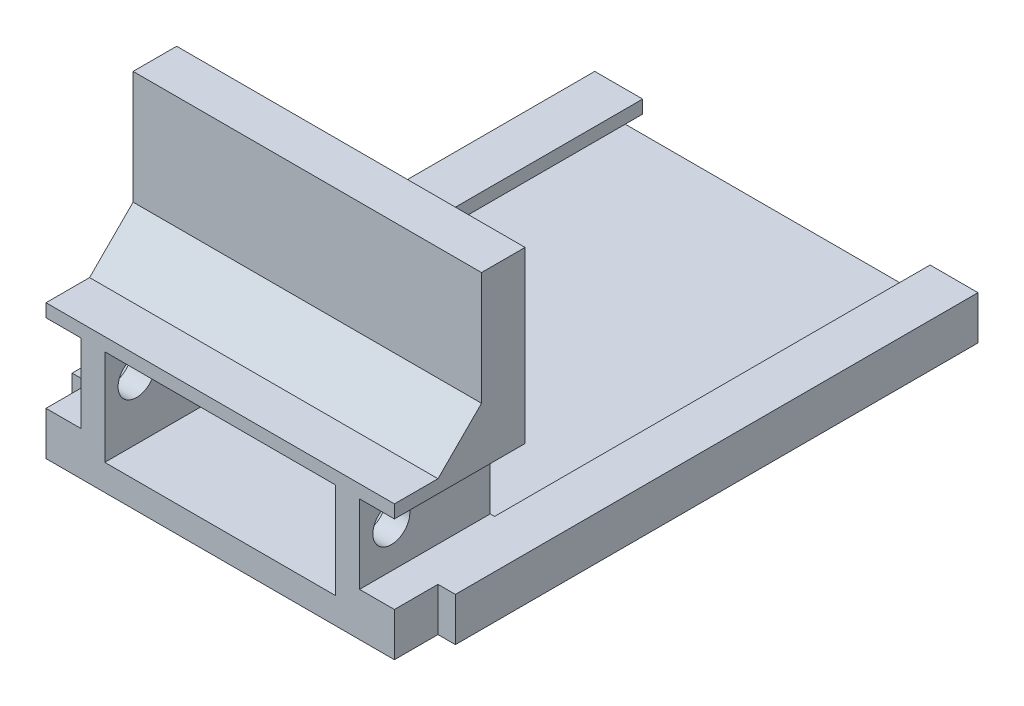
ISO-10303-21;
HEADER;
FILE_DESCRIPTION(('STEP AP214'),'2;1');
FILE_NAME('part.step','',(''),(''),'','','');
FILE_SCHEMA(('AUTOMOTIVE_DESIGN { 1 0 10303 214 1 1 1 1 }'));
ENDSEC;
DATA;
#1=APPLICATION_CONTEXT('core data for automotive mechanical design processes');
#2=APPLICATION_PROTOCOL_DEFINITION('international standard','automotive_design',2000,#1);
#3=PRODUCT_CONTEXT('',#1,'mechanical');
#4=PRODUCT('Part','Part','',(#3));
#5=PRODUCT_RELATED_PRODUCT_CATEGORY('part','',(#4));
#6=PRODUCT_DEFINITION_FORMATION('','',#4);
#7=PRODUCT_DEFINITION_CONTEXT('part definition',#1,'design');
#8=PRODUCT_DEFINITION('design','',#6,#7);
#9=PRODUCT_DEFINITION_SHAPE('','',#8);
#10=(LENGTH_UNIT() NAMED_UNIT(*) SI_UNIT(.MILLI.,.METRE.));
#11=(NAMED_UNIT(*) PLANE_ANGLE_UNIT() SI_UNIT($,.RADIAN.));
#12=(NAMED_UNIT(*) SI_UNIT($,.STERADIAN.) SOLID_ANGLE_UNIT());
#13=UNCERTAINTY_MEASURE_WITH_UNIT(LENGTH_MEASURE(1.E-05),#10,'distance_accuracy_value','');
#14=(GEOMETRIC_REPRESENTATION_CONTEXT(3) GLOBAL_UNCERTAINTY_ASSIGNED_CONTEXT((#13)) GLOBAL_UNIT_ASSIGNED_CONTEXT((#10,
#11,#12)) REPRESENTATION_CONTEXT('',''));
#15=CARTESIAN_POINT('',(0.,0.,0.));
#16=DIRECTION('',(0.,0.,1.));
#17=DIRECTION('',(1.,0.,0.));
#18=AXIS2_PLACEMENT_3D('',#15,#16,#17);
#19=CARTESIAN_POINT('',(3.99999999999999,0.,120.));
#20=DIRECTION('',(-1.,0.,0.));
#21=DIRECTION('',(0.,-1.,0.));
#22=AXIS2_PLACEMENT_3D('',#19,#20,#21);
#23=PLANE('',#22);
#24=DIRECTION('',(0.,-1.,0.));
#25=VECTOR('',#24,1.);
#26=CARTESIAN_POINT('',(3.99999999999999,57.,110.));
#27=LINE('',#26,#25);
#28=CARTESIAN_POINT('',(3.99999999999999,57.,110.));
#29=VERTEX_POINT('',#28);
#30=CARTESIAN_POINT('',(3.99999999999999,31.,110.));
#31=VERTEX_POINT('',#30);
#32=EDGE_CURVE('E246',#29,#31,#27,.T.);
#33=ORIENTED_EDGE('',*,*,#32,.F.);
#34=DIRECTION('',(0.,0.,-1.));
#35=VECTOR('',#34,1.);
#36=CARTESIAN_POINT('',(3.99999999999999,57.,120.));
#37=LINE('',#36,#35);
#38=CARTESIAN_POINT('',(3.99999999999999,57.,100.));
#39=VERTEX_POINT('',#38);
#40=EDGE_CURVE('E254',#29,#39,#37,.T.);
#41=ORIENTED_EDGE('',*,*,#40,.T.);
#42=DIRECTION('',(0.,1.,0.));
#43=VECTOR('',#42,1.);
#44=CARTESIAN_POINT('',(3.99999999999999,0.,100.));
#45=LINE('',#44,#43);
#46=CARTESIAN_POINT('',(3.99999999999999,18.,100.));
#47=VERTEX_POINT('',#46);
#48=EDGE_CURVE('E474',#47,#39,#45,.T.);
#49=ORIENTED_EDGE('',*,*,#48,.F.);
#50=DIRECTION('',(0.,0.,1.));
#51=VECTOR('',#50,1.);
#52=CARTESIAN_POINT('',(3.99999999999999,18.,42.6153330583857));
#53=LINE('',#52,#51);
#54=CARTESIAN_POINT('',(3.99999999999999,18.,130.));
#55=VERTEX_POINT('',#54);
#56=EDGE_CURVE('E489',#47,#55,#53,.T.);
#57=ORIENTED_EDGE('',*,*,#56,.T.);
#58=DIRECTION('',(0.,-1.,0.));
#59=VECTOR('',#58,1.);
#60=CARTESIAN_POINT('',(3.99999999999999,-10.,130.));
#61=LINE('',#60,#59);
#62=CARTESIAN_POINT('',(3.99999999999999,21.,130.));
#63=VERTEX_POINT('',#62);
#64=EDGE_CURVE('E491',#63,#55,#61,.T.);
#65=ORIENTED_EDGE('',*,*,#64,.F.);
#66=DIRECTION('',(0.,0.,-1.));
#67=VECTOR('',#66,1.);
#68=CARTESIAN_POINT('',(3.99999999999999,21.,130.));
#69=LINE('',#68,#67);
#70=CARTESIAN_POINT('',(3.99999999999999,21.,120.));
#71=VERTEX_POINT('',#70);
#72=EDGE_CURVE('E523',#63,#71,#69,.T.);
#73=ORIENTED_EDGE('',*,*,#72,.T.);
#74=DIRECTION('',(0.,-0.707106781186544,0.707106781186551));
#75=VECTOR('',#74,1.);
#76=CARTESIAN_POINT('',(3.99999999999999,21.,120.));
#77=LINE('',#76,#75);
#78=EDGE_CURVE('E52',#71,#31,#77,.F.);
#79=ORIENTED_EDGE('',*,*,#78,.T.);
#80=EDGE_LOOP('',(#33,#41,#49,#57,#65,#73,#79));
#81=FACE_BOUND('',#80,.T.);
#82=ADVANCED_FACE('F42',(#81),#23,.T.);
#83=CARTESIAN_POINT('',(84.,0.,120.));
#84=DIRECTION('',(-1.,0.,0.));
#85=DIRECTION('',(0.,-1.,0.));
#86=AXIS2_PLACEMENT_3D('',#83,#84,#85);
#87=PLANE('',#86);
#88=DIRECTION('',(0.,1.,0.));
#89=VECTOR('',#88,1.);
#90=CARTESIAN_POINT('',(84.,-10.,120.));
#91=LINE('',#90,#89);
#92=CARTESIAN_POINT('',(84.,-10.,120.));
#93=VERTEX_POINT('',#92);
#94=CARTESIAN_POINT('',(84.,0.,120.));
#95=VERTEX_POINT('',#94);
#96=EDGE_CURVE('E514',#93,#95,#91,.T.);
#97=ORIENTED_EDGE('',*,*,#96,.T.);
#98=DIRECTION('',(0.,0.,1.));
#99=VECTOR('',#98,1.);
#100=CARTESIAN_POINT('',(84.,0.,42.6153330583857));
#101=LINE('',#100,#99);
#102=CARTESIAN_POINT('',(84.,0.,130.));
#103=VERTEX_POINT('',#102);
#104=EDGE_CURVE('E566',#95,#103,#101,.T.);
#105=ORIENTED_EDGE('',*,*,#104,.T.);
#106=DIRECTION('',(0.,1.,0.));
#107=VECTOR('',#106,1.);
#108=CARTESIAN_POINT('',(84.,-10.,130.));
#109=LINE('',#108,#107);
#110=CARTESIAN_POINT('',(84.,-10.,130.));
#111=VERTEX_POINT('',#110);
#112=EDGE_CURVE('E519',#111,#103,#109,.T.);
#113=ORIENTED_EDGE('',*,*,#112,.F.);
#114=DIRECTION('',(0.,0.,-1.));
#115=VECTOR('',#114,1.);
#116=CARTESIAN_POINT('',(84.,-10.,130.));
#117=LINE('',#116,#115);
#118=EDGE_CURVE('E534',#111,#93,#117,.T.);
#119=ORIENTED_EDGE('',*,*,#118,.T.);
#120=EDGE_LOOP('',(#97,#105,#113,#119));
#121=FACE_BOUND('',#120,.T.);
#122=ADVANCED_FACE('F662',(#121),#87,.F.);
#123=CARTESIAN_POINT('',(0.,0.,120.));
#124=DIRECTION('',(0.,0.,1.));
#125=DIRECTION('',(1.,0.,0.));
#126=AXIS2_PLACEMENT_3D('',#123,#124,#125);
#127=PLANE('',#126);
#128=DIRECTION('',(0.,-1.,0.));
#129=VECTOR('',#128,1.);
#130=CARTESIAN_POINT('',(3.99999999999999,-10.,120.));
#131=LINE('',#130,#129);
#132=CARTESIAN_POINT('',(3.99999999999999,0.,120.));
#133=VERTEX_POINT('',#132);
#134=CARTESIAN_POINT('',(3.99999999999999,-10.,120.));
#135=VERTEX_POINT('',#134);
#136=EDGE_CURVE('E378',#133,#135,#131,.T.);
#137=ORIENTED_EDGE('',*,*,#136,.F.);
#138=DIRECTION('',(-1.,0.,0.));
#139=VECTOR('',#138,1.);
#140=CARTESIAN_POINT('',(0.,0.,120.));
#141=LINE('',#140,#139);
#142=CARTESIAN_POINT('',(0.,0.,120.));
#143=VERTEX_POINT('',#142);
#144=EDGE_CURVE('E461',#133,#143,#141,.T.);
#145=ORIENTED_EDGE('',*,*,#144,.T.);
#146=DIRECTION('',(0.,-1.,0.));
#147=VECTOR('',#146,1.);
#148=CARTESIAN_POINT('',(0.,0.,120.));
#149=LINE('',#148,#147);
#150=CARTESIAN_POINT('',(0.,-10.,120.));
#151=VERTEX_POINT('',#150);
#152=EDGE_CURVE('E455',#143,#151,#149,.T.);
#153=ORIENTED_EDGE('',*,*,#152,.T.);
#154=DIRECTION('',(1.,0.,0.));
#155=VECTOR('',#154,1.);
#156=CARTESIAN_POINT('',(0.,-10.,120.));
#157=LINE('',#156,#155);
#158=EDGE_CURVE('E450',#151,#135,#157,.T.);
#159=ORIENTED_EDGE('',*,*,#158,.T.);
#160=EDGE_LOOP('',(#137,#145,#153,#159));
#161=FACE_BOUND('',#160,.T.);
#162=ADVANCED_FACE('F459',(#161),#127,.T.);
#163=CARTESIAN_POINT('',(0.,-3.,100.));
#164=DIRECTION('',(0.,1.,0.));
#165=DIRECTION('',(0.,0.,1.));
#166=AXIS2_PLACEMENT_3D('',#163,#164,#165);
#167=PLANE('',#166);
#168=DIRECTION('',(1.,0.,0.));
#169=VECTOR('',#168,1.);
#170=CARTESIAN_POINT('',(0.,-3.,0.));
#171=LINE('',#170,#169);
#172=CARTESIAN_POINT('',(77.,-3.,0.));
#173=VERTEX_POINT('',#172);
#174=CARTESIAN_POINT('',(85.,-3.,0.));
#175=VERTEX_POINT('',#174);
#176=EDGE_CURVE('E269',#173,#175,#171,.T.);
#177=ORIENTED_EDGE('',*,*,#176,.T.);
#178=DIRECTION('',(0.,0.,-1.));
#179=VECTOR('',#178,1.);
#180=CARTESIAN_POINT('',(85.,-3.,100.));
#181=LINE('',#180,#179);
#182=CARTESIAN_POINT('',(85.,-3.,100.));
#183=VERTEX_POINT('',#182);
#184=EDGE_CURVE('E374',#183,#175,#181,.T.);
#185=ORIENTED_EDGE('',*,*,#184,.F.);
#186=DIRECTION('',(1.,0.,0.));
#187=VECTOR('',#186,1.);
#188=CARTESIAN_POINT('',(0.,-3.,100.));
#189=LINE('',#188,#187);
#190=CARTESIAN_POINT('',(77.,-3.,100.));
#191=VERTEX_POINT('',#190);
#192=EDGE_CURVE('E277',#191,#183,#189,.T.);
#193=ORIENTED_EDGE('',*,*,#192,.F.);
#194=DIRECTION('',(0.,0.,-1.));
#195=VECTOR('',#194,1.);
#196=CARTESIAN_POINT('',(77.,-3.,100.));
#197=LINE('',#196,#195);
#198=EDGE_CURVE('E301',#191,#173,#197,.T.);
#199=ORIENTED_EDGE('',*,*,#198,.T.);
#200=EDGE_LOOP('',(#177,#185,#193,#199));
#201=FACE_BOUND('',#200,.T.);
#202=ADVANCED_FACE('F428',(#201),#167,.F.);
#203=CARTESIAN_POINT('',(85.,0.,100.));
#204=DIRECTION('',(1.,0.,0.));
#205=DIRECTION('',(0.,0.,-1.));
#206=AXIS2_PLACEMENT_3D('',#203,#204,#205);
#207=PLANE('',#206);
#208=DIRECTION('',(0.,-1.,0.));
#209=VECTOR('',#208,1.);
#210=CARTESIAN_POINT('',(85.,0.,0.));
#211=LINE('',#210,#209);
#212=CARTESIAN_POINT('',(85.,-7.,0.));
#213=VERTEX_POINT('',#212);
#214=EDGE_CURVE('E305',#175,#213,#211,.T.);
#215=ORIENTED_EDGE('',*,*,#214,.T.);
#216=DIRECTION('',(0.,0.,-1.));
#217=VECTOR('',#216,1.);
#218=CARTESIAN_POINT('',(85.,-7.,100.));
#219=LINE('',#218,#217);
#220=CARTESIAN_POINT('',(85.,-7.,100.));
#221=VERTEX_POINT('',#220);
#222=EDGE_CURVE('E371',#221,#213,#219,.T.);
#223=ORIENTED_EDGE('',*,*,#222,.F.);
#224=DIRECTION('',(0.,-1.,0.));
#225=VECTOR('',#224,1.);
#226=CARTESIAN_POINT('',(85.,0.,100.));
#227=LINE('',#226,#225);
#228=EDGE_CURVE('E280',#183,#221,#227,.T.);
#229=ORIENTED_EDGE('',*,*,#228,.F.);
#230=ORIENTED_EDGE('',*,*,#184,.T.);
#231=EDGE_LOOP('',(#215,#223,#229,#230));
#232=FACE_BOUND('',#231,.T.);
#233=ADVANCED_FACE('F425',(#232),#207,.F.);
#234=CARTESIAN_POINT('',(0.,-7.,100.));
#235=DIRECTION('',(0.,1.,0.));
#236=DIRECTION('',(0.,0.,1.));
#237=AXIS2_PLACEMENT_3D('',#234,#235,#236);
#238=PLANE('',#237);
#239=DIRECTION('',(1.,0.,0.));
#240=VECTOR('',#239,1.);
#241=CARTESIAN_POINT('',(0.,-7.,0.));
#242=LINE('',#241,#240);
#243=CARTESIAN_POINT('',(3.,-7.,0.));
#244=VERTEX_POINT('',#243);
#245=EDGE_CURVE('E310',#244,#213,#242,.T.);
#246=ORIENTED_EDGE('',*,*,#245,.F.);
#247=DIRECTION('',(0.,0.,-1.));
#248=VECTOR('',#247,1.);
#249=CARTESIAN_POINT('',(3.,-7.,100.));
#250=LINE('',#249,#248);
#251=CARTESIAN_POINT('',(3.,-7.,100.));
#252=VERTEX_POINT('',#251);
#253=EDGE_CURVE('E368',#252,#244,#250,.T.);
#254=ORIENTED_EDGE('',*,*,#253,.F.);
#255=DIRECTION('',(1.,0.,0.));
#256=VECTOR('',#255,1.);
#257=CARTESIAN_POINT('',(0.,-7.,100.));
#258=LINE('',#257,#256);
#259=EDGE_CURVE('E286',#252,#221,#258,.T.);
#260=ORIENTED_EDGE('',*,*,#259,.T.);
#261=ORIENTED_EDGE('',*,*,#222,.T.);
#262=EDGE_LOOP('',(#246,#254,#260,#261));
#263=FACE_BOUND('',#262,.T.);
#264=ADVANCED_FACE('F421',(#263),#238,.T.);
#265=CARTESIAN_POINT('',(3.,0.,100.));
#266=DIRECTION('',(1.,0.,0.));
#267=DIRECTION('',(0.,1.,0.));
#268=AXIS2_PLACEMENT_3D('',#265,#266,#267);
#269=PLANE('',#268);
#270=DIRECTION('',(0.,-1.,0.));
#271=VECTOR('',#270,1.);
#272=CARTESIAN_POINT('',(3.,0.,0.));
#273=LINE('',#272,#271);
#274=CARTESIAN_POINT('',(3.,-3.,0.));
#275=VERTEX_POINT('',#274);
#276=EDGE_CURVE('E314',#275,#244,#273,.T.);
#277=ORIENTED_EDGE('',*,*,#276,.F.);
#278=DIRECTION('',(0.,0.,-1.));
#279=VECTOR('',#278,1.);
#280=CARTESIAN_POINT('',(3.,-3.,100.));
#281=LINE('',#280,#279);
#282=CARTESIAN_POINT('',(3.,-3.,100.));
#283=VERTEX_POINT('',#282);
#284=EDGE_CURVE('E365',#283,#275,#281,.T.);
#285=ORIENTED_EDGE('',*,*,#284,.F.);
#286=DIRECTION('',(0.,-1.,0.));
#287=VECTOR('',#286,1.);
#288=CARTESIAN_POINT('',(3.,0.,100.));
#289=LINE('',#288,#287);
#290=EDGE_CURVE('E289',#283,#252,#289,.T.);
#291=ORIENTED_EDGE('',*,*,#290,.T.);
#292=ORIENTED_EDGE('',*,*,#253,.T.);
#293=EDGE_LOOP('',(#277,#285,#291,#292));
#294=FACE_BOUND('',#293,.T.);
#295=ADVANCED_FACE('F418',(#294),#269,.T.);
#296=CARTESIAN_POINT('',(11.,-3.,0.));
#297=VERTEX_POINT('',#296);
#298=EDGE_CURVE('E306',#275,#297,#171,.T.);
#299=ORIENTED_EDGE('',*,*,#298,.T.);
#300=DIRECTION('',(0.,0.,-1.));
#301=VECTOR('',#300,1.);
#302=CARTESIAN_POINT('',(11.,-3.,100.));
#303=LINE('',#302,#301);
#304=CARTESIAN_POINT('',(11.,-3.,100.));
#305=VERTEX_POINT('',#304);
#306=EDGE_CURVE('E362',#305,#297,#303,.T.);
#307=ORIENTED_EDGE('',*,*,#306,.F.);
#308=EDGE_CURVE('E282',#283,#305,#189,.T.);
#309=ORIENTED_EDGE('',*,*,#308,.F.);
#310=ORIENTED_EDGE('',*,*,#284,.T.);
#311=EDGE_LOOP('',(#299,#307,#309,#310));
#312=FACE_BOUND('',#311,.T.);
#313=ADVANCED_FACE('F396',(#312),#167,.F.);
#314=CARTESIAN_POINT('',(11.,0.,100.));
#315=DIRECTION('',(1.,0.,0.));
#316=DIRECTION('',(0.,0.,-1.));
#317=AXIS2_PLACEMENT_3D('',#314,#315,#316);
#318=PLANE('',#317);
#319=DIRECTION('',(0.,-1.,0.));
#320=VECTOR('',#319,1.);
#321=CARTESIAN_POINT('',(11.,0.,0.));
#322=LINE('',#321,#320);
#323=CARTESIAN_POINT('',(11.,0.,0.));
#324=VERTEX_POINT('',#323);
#325=EDGE_CURVE('E318',#324,#297,#322,.T.);
#326=ORIENTED_EDGE('',*,*,#325,.F.);
#327=DIRECTION('',(0.,0.,-1.));
#328=VECTOR('',#327,1.);
#329=CARTESIAN_POINT('',(11.,0.,100.));
#330=LINE('',#329,#328);
#331=CARTESIAN_POINT('',(11.,0.,100.));
#332=VERTEX_POINT('',#331);
#333=EDGE_CURVE('E359',#332,#324,#330,.T.);
#334=ORIENTED_EDGE('',*,*,#333,.F.);
#335=DIRECTION('',(0.,-1.,0.));
#336=VECTOR('',#335,1.);
#337=CARTESIAN_POINT('',(11.,0.,100.));
#338=LINE('',#337,#336);
#339=EDGE_CURVE('E293',#332,#305,#338,.T.);
#340=ORIENTED_EDGE('',*,*,#339,.T.);
#341=ORIENTED_EDGE('',*,*,#306,.T.);
#342=EDGE_LOOP('',(#326,#334,#340,#341));
#343=FACE_BOUND('',#342,.T.);
#344=ADVANCED_FACE('F407',(#343),#318,.T.);
#345=CARTESIAN_POINT('',(0.,0.,100.));
#346=DIRECTION('',(0.,1.,0.));
#347=DIRECTION('',(0.,0.,1.));
#348=AXIS2_PLACEMENT_3D('',#345,#346,#347);
#349=PLANE('',#348);
#350=DIRECTION('',(1.,0.,0.));
#351=VECTOR('',#350,1.);
#352=CARTESIAN_POINT('',(0.,0.,0.));
#353=LINE('',#352,#351);
#354=CARTESIAN_POINT('',(0.,0.,0.));
#355=VERTEX_POINT('',#354);
#356=EDGE_CURVE('E322',#355,#324,#353,.T.);
#357=ORIENTED_EDGE('',*,*,#356,.F.);
#358=DIRECTION('',(0.,0.,-1.));
#359=VECTOR('',#358,1.);
#360=CARTESIAN_POINT('',(0.,0.,100.));
#361=LINE('',#360,#359);
#362=EDGE_CURVE('E356',#143,#355,#361,.T.);
#363=ORIENTED_EDGE('',*,*,#362,.F.);
#364=ORIENTED_EDGE('',*,*,#144,.F.);
#365=DIRECTION('',(0.,0.,1.));
#366=VECTOR('',#365,1.);
#367=CARTESIAN_POINT('',(3.99999999999999,0.,42.6153330583857));
#368=LINE('',#367,#366);
#369=CARTESIAN_POINT('',(3.99999999999999,0.,130.));
#370=VERTEX_POINT('',#369);
#371=EDGE_CURVE('E544',#133,#370,#368,.T.);
#372=ORIENTED_EDGE('',*,*,#371,.T.);
#373=DIRECTION('',(1.,0.,0.));
#374=VECTOR('',#373,1.);
#375=CARTESIAN_POINT('',(3.99999999999999,0.,130.));
#376=LINE('',#375,#374);
#377=CARTESIAN_POINT('',(12.,0.,130.));
#378=VERTEX_POINT('',#377);
#379=EDGE_CURVE('E595',#370,#378,#376,.T.);
#380=ORIENTED_EDGE('',*,*,#379,.T.);
#381=DIRECTION('',(0.,0.,1.));
#382=VECTOR('',#381,1.);
#383=CARTESIAN_POINT('',(12.,0.,42.6153330583857));
#384=LINE('',#383,#382);
#385=CARTESIAN_POINT('',(12.,0.,100.));
#386=VERTEX_POINT('',#385);
#387=EDGE_CURVE('E550',#386,#378,#384,.T.);
#388=ORIENTED_EDGE('',*,*,#387,.F.);
#389=DIRECTION('',(-1.,0.,0.));
#390=VECTOR('',#389,1.);
#391=CARTESIAN_POINT('',(3.99999999999999,0.,100.));
#392=LINE('',#391,#390);
#393=EDGE_CURVE('E414',#386,#332,#392,.T.);
#394=ORIENTED_EDGE('',*,*,#393,.T.);
#395=ORIENTED_EDGE('',*,*,#333,.T.);
#396=EDGE_LOOP('',(#357,#363,#364,#372,#380,#388,#394,#395));
#397=FACE_BOUND('',#396,.T.);
#398=ADVANCED_FACE('F546',(#397),#349,.T.);
#399=CARTESIAN_POINT('',(0.,0.,100.));
#400=DIRECTION('',(1.,0.,0.));
#401=DIRECTION('',(0.,0.,-1.));
#402=AXIS2_PLACEMENT_3D('',#399,#400,#401);
#403=PLANE('',#402);
#404=DIRECTION('',(0.,-1.,0.));
#405=VECTOR('',#404,1.);
#406=CARTESIAN_POINT('',(0.,0.,0.));
#407=LINE('',#406,#405);
#408=CARTESIAN_POINT('',(0.,-10.,0.));
#409=VERTEX_POINT('',#408);
#410=EDGE_CURVE('E326',#355,#409,#407,.T.);
#411=ORIENTED_EDGE('',*,*,#410,.T.);
#412=DIRECTION('',(0.,0.,-1.));
#413=VECTOR('',#412,1.);
#414=CARTESIAN_POINT('',(0.,-10.,100.));
#415=LINE('',#414,#413);
#416=EDGE_CURVE('E352',#151,#409,#415,.T.);
#417=ORIENTED_EDGE('',*,*,#416,.F.);
#418=ORIENTED_EDGE('',*,*,#152,.F.);
#419=ORIENTED_EDGE('',*,*,#362,.T.);
#420=EDGE_LOOP('',(#411,#417,#418,#419));
#421=FACE_BOUND('',#420,.T.);
#422=ADVANCED_FACE('F454',(#421),#403,.F.);
#423=CARTESIAN_POINT('',(0.,-10.,100.));
#424=DIRECTION('',(0.,1.,0.));
#425=DIRECTION('',(0.,0.,1.));
#426=AXIS2_PLACEMENT_3D('',#423,#424,#425);
#427=PLANE('',#426);
#428=DIRECTION('',(0.,0.,-1.));
#429=VECTOR('',#428,1.);
#430=CARTESIAN_POINT('',(3.99999999999999,-10.,130.));
#431=LINE('',#430,#429);
#432=CARTESIAN_POINT('',(3.99999999999999,-10.,130.));
#433=VERTEX_POINT('',#432);
#434=EDGE_CURVE('E477',#433,#135,#431,.T.);
#435=ORIENTED_EDGE('',*,*,#434,.T.);
#436=ORIENTED_EDGE('',*,*,#158,.F.);
#437=ORIENTED_EDGE('',*,*,#416,.T.);
#438=DIRECTION('',(1.,0.,0.));
#439=VECTOR('',#438,1.);
#440=CARTESIAN_POINT('',(0.,-10.,0.));
#441=LINE('',#440,#439);
#442=CARTESIAN_POINT('',(88.,-10.,0.));
#443=VERTEX_POINT('',#442);
#444=EDGE_CURVE('E330',#409,#443,#441,.T.);
#445=ORIENTED_EDGE('',*,*,#444,.T.);
#446=DIRECTION('',(0.,0.,-1.));
#447=VECTOR('',#446,1.);
#448=CARTESIAN_POINT('',(88.,-10.,100.));
#449=LINE('',#448,#447);
#450=CARTESIAN_POINT('',(88.,-10.,120.));
#451=VERTEX_POINT('',#450);
#452=EDGE_CURVE('E349',#451,#443,#449,.T.);
#453=ORIENTED_EDGE('',*,*,#452,.F.);
#454=EDGE_CURVE('E463',#93,#451,#157,.T.);
#455=ORIENTED_EDGE('',*,*,#454,.F.);
#456=ORIENTED_EDGE('',*,*,#118,.F.);
#457=DIRECTION('',(1.,0.,0.));
#458=VECTOR('',#457,1.);
#459=CARTESIAN_POINT('',(3.99999999999999,-10.,130.));
#460=LINE('',#459,#458);
#461=EDGE_CURVE('E507',#433,#111,#460,.T.);
#462=ORIENTED_EDGE('',*,*,#461,.F.);
#463=EDGE_LOOP('',(#435,#436,#437,#445,#453,#455,#456,#462));
#464=FACE_BOUND('',#463,.T.);
#465=ADVANCED_FACE('F447',(#464),#427,.F.);
#466=CARTESIAN_POINT('',(88.,0.,100.));
#467=DIRECTION('',(1.,0.,0.));
#468=DIRECTION('',(0.,0.,-1.));
#469=AXIS2_PLACEMENT_3D('',#466,#467,#468);
#470=PLANE('',#469);
#471=DIRECTION('',(0.,-1.,0.));
#472=VECTOR('',#471,1.);
#473=CARTESIAN_POINT('',(88.,0.,0.));
#474=LINE('',#473,#472);
#475=CARTESIAN_POINT('',(88.,0.,0.));
#476=VERTEX_POINT('',#475);
#477=EDGE_CURVE('E334',#476,#443,#474,.T.);
#478=ORIENTED_EDGE('',*,*,#477,.F.);
#479=DIRECTION('',(0.,0.,-1.));
#480=VECTOR('',#479,1.);
#481=CARTESIAN_POINT('',(88.,0.,100.));
#482=LINE('',#481,#480);
#483=CARTESIAN_POINT('',(88.,0.,120.));
#484=VERTEX_POINT('',#483);
#485=EDGE_CURVE('E346',#484,#476,#482,.T.);
#486=ORIENTED_EDGE('',*,*,#485,.F.);
#487=DIRECTION('',(0.,1.,0.));
#488=VECTOR('',#487,1.);
#489=CARTESIAN_POINT('',(88.,0.,120.));
#490=LINE('',#489,#488);
#491=EDGE_CURVE('E272',#451,#484,#490,.T.);
#492=ORIENTED_EDGE('',*,*,#491,.F.);
#493=ORIENTED_EDGE('',*,*,#452,.T.);
#494=EDGE_LOOP('',(#478,#486,#492,#493));
#495=FACE_BOUND('',#494,.T.);
#496=ADVANCED_FACE('F442',(#495),#470,.T.);
#497=CARTESIAN_POINT('',(77.,0.,0.));
#498=VERTEX_POINT('',#497);
#499=EDGE_CURVE('E327',#498,#476,#353,.T.);
#500=ORIENTED_EDGE('',*,*,#499,.F.);
#501=DIRECTION('',(0.,0.,-1.));
#502=VECTOR('',#501,1.);
#503=CARTESIAN_POINT('',(77.,0.,100.));
#504=LINE('',#503,#502);
#505=CARTESIAN_POINT('',(77.,0.,100.));
#506=VERTEX_POINT('',#505);
#507=EDGE_CURVE('E343',#506,#498,#504,.T.);
#508=ORIENTED_EDGE('',*,*,#507,.F.);
#509=DIRECTION('',(-1.,0.,0.));
#510=VECTOR('',#509,1.);
#511=CARTESIAN_POINT('',(84.,0.,100.));
#512=LINE('',#511,#510);
#513=CARTESIAN_POINT('',(76.,0.,100.));
#514=VERTEX_POINT('',#513);
#515=EDGE_CURVE('E565',#506,#514,#512,.T.);
#516=ORIENTED_EDGE('',*,*,#515,.T.);
#517=DIRECTION('',(0.,0.,1.));
#518=VECTOR('',#517,1.);
#519=CARTESIAN_POINT('',(76.,0.,42.6153330583857));
#520=LINE('',#519,#518);
#521=CARTESIAN_POINT('',(76.,0.,130.));
#522=VERTEX_POINT('',#521);
#523=EDGE_CURVE('E585',#514,#522,#520,.T.);
#524=ORIENTED_EDGE('',*,*,#523,.T.);
#525=DIRECTION('',(1.,0.,0.));
#526=VECTOR('',#525,1.);
#527=CARTESIAN_POINT('',(84.,0.,130.));
#528=LINE('',#527,#526);
#529=EDGE_CURVE('E578',#522,#103,#528,.T.);
#530=ORIENTED_EDGE('',*,*,#529,.T.);
#531=ORIENTED_EDGE('',*,*,#104,.F.);
#532=DIRECTION('',(-1.,0.,0.));
#533=VECTOR('',#532,1.);
#534=CARTESIAN_POINT('',(0.,0.,120.));
#535=LINE('',#534,#533);
#536=EDGE_CURVE('E265',#484,#95,#535,.T.);
#537=ORIENTED_EDGE('',*,*,#536,.F.);
#538=ORIENTED_EDGE('',*,*,#485,.T.);
#539=EDGE_LOOP('',(#500,#508,#516,#524,#530,#531,#537,#538));
#540=FACE_BOUND('',#539,.T.);
#541=ADVANCED_FACE('F435',(#540),#349,.T.);
#542=CARTESIAN_POINT('',(77.,-3.56196553733904E-13,100.));
#543=DIRECTION('',(1.,0.,0.));
#544=DIRECTION('',(0.,1.,0.));
#545=AXIS2_PLACEMENT_3D('',#542,#543,#544);
#546=PLANE('',#545);
#547=DIRECTION('',(0.,-1.,0.));
#548=VECTOR('',#547,1.);
#549=CARTESIAN_POINT('',(77.,-3.56196553733904E-13,0.));
#550=LINE('',#549,#548);
#551=EDGE_CURVE('E281',#498,#173,#550,.T.);
#552=ORIENTED_EDGE('',*,*,#551,.T.);
#553=ORIENTED_EDGE('',*,*,#198,.F.);
#554=DIRECTION('',(0.,-1.,0.));
#555=VECTOR('',#554,1.);
#556=CARTESIAN_POINT('',(77.,-3.56196553733904E-13,100.));
#557=LINE('',#556,#555);
#558=EDGE_CURVE('E297',#506,#191,#557,.T.);
#559=ORIENTED_EDGE('',*,*,#558,.F.);
#560=ORIENTED_EDGE('',*,*,#507,.T.);
#561=EDGE_LOOP('',(#552,#553,#559,#560));
#562=FACE_BOUND('',#561,.T.);
#563=ADVANCED_FACE('F678',(#562),#546,.F.);
#564=CARTESIAN_POINT('',(0.,0.,0.));
#565=DIRECTION('',(0.,0.,1.));
#566=DIRECTION('',(1.,0.,0.));
#567=AXIS2_PLACEMENT_3D('',#564,#565,#566);
#568=PLANE('',#567);
#569=ORIENTED_EDGE('',*,*,#176,.F.);
#570=ORIENTED_EDGE('',*,*,#551,.F.);
#571=ORIENTED_EDGE('',*,*,#499,.T.);
#572=ORIENTED_EDGE('',*,*,#477,.T.);
#573=ORIENTED_EDGE('',*,*,#444,.F.);
#574=ORIENTED_EDGE('',*,*,#410,.F.);
#575=ORIENTED_EDGE('',*,*,#356,.T.);
#576=ORIENTED_EDGE('',*,*,#325,.T.);
#577=ORIENTED_EDGE('',*,*,#298,.F.);
#578=ORIENTED_EDGE('',*,*,#276,.T.);
#579=ORIENTED_EDGE('',*,*,#245,.T.);
#580=ORIENTED_EDGE('',*,*,#214,.F.);
#581=EDGE_LOOP('',(#569,#570,#571,#572,#573,#574,#575,#576,#577,#578,#579,#580));
#582=FACE_BOUND('',#581,.T.);
#583=ADVANCED_FACE('F402',(#582),#568,.F.);
#584=ORIENTED_EDGE('',*,*,#371,.F.);
#585=ORIENTED_EDGE('',*,*,#136,.T.);
#586=ORIENTED_EDGE('',*,*,#434,.F.);
#587=EDGE_CURVE('E508',#370,#433,#61,.T.);
#588=ORIENTED_EDGE('',*,*,#587,.F.);
#589=EDGE_LOOP('',(#584,#585,#586,#588));
#590=FACE_BOUND('',#589,.T.);
#591=ADVANCED_FACE('F543',(#590),#23,.T.);
#592=DIRECTION('',(0.,0.,-1.));
#593=VECTOR('',#592,1.);
#594=CARTESIAN_POINT('',(84.,57.,120.));
#595=LINE('',#594,#593);
#596=CARTESIAN_POINT('',(84.,57.,110.));
#597=VERTEX_POINT('',#596);
#598=CARTESIAN_POINT('',(84.,57.,100.));
#599=VERTEX_POINT('',#598);
#600=EDGE_CURVE('E264',#597,#599,#595,.T.);
#601=ORIENTED_EDGE('',*,*,#600,.F.);
#602=DIRECTION('',(0.,1.,0.));
#603=VECTOR('',#602,1.);
#604=CARTESIAN_POINT('',(84.,57.,110.));
#605=LINE('',#604,#603);
#606=CARTESIAN_POINT('',(84.,31.,110.));
#607=VERTEX_POINT('',#606);
#608=EDGE_CURVE('E247',#607,#597,#605,.T.);
#609=ORIENTED_EDGE('',*,*,#608,.F.);
#610=DIRECTION('',(0.,0.707106781186544,-0.707106781186551));
#611=VECTOR('',#610,1.);
#612=CARTESIAN_POINT('',(84.,10.5000000000002,130.5));
#613=LINE('',#612,#611);
#614=CARTESIAN_POINT('',(84.,21.,120.));
#615=VERTEX_POINT('',#614);
#616=EDGE_CURVE('E11',#607,#615,#613,.F.);
#617=ORIENTED_EDGE('',*,*,#616,.T.);
#618=DIRECTION('',(0.,0.,-1.));
#619=VECTOR('',#618,1.);
#620=CARTESIAN_POINT('',(84.,21.,130.));
#621=LINE('',#620,#619);
#622=CARTESIAN_POINT('',(84.,21.,130.));
#623=VERTEX_POINT('',#622);
#624=EDGE_CURVE('E530',#623,#615,#621,.T.);
#625=ORIENTED_EDGE('',*,*,#624,.F.);
#626=CARTESIAN_POINT('',(84.,18.,130.));
#627=VERTEX_POINT('',#626);
#628=EDGE_CURVE('E512',#627,#623,#109,.T.);
#629=ORIENTED_EDGE('',*,*,#628,.F.);
#630=DIRECTION('',(0.,0.,1.));
#631=VECTOR('',#630,1.);
#632=CARTESIAN_POINT('',(84.,18.,42.6153330583857));
#633=LINE('',#632,#631);
#634=CARTESIAN_POINT('',(84.,18.,100.));
#635=VERTEX_POINT('',#634);
#636=EDGE_CURVE('E581',#635,#627,#633,.T.);
#637=ORIENTED_EDGE('',*,*,#636,.F.);
#638=DIRECTION('',(0.,1.,0.));
#639=VECTOR('',#638,1.);
#640=CARTESIAN_POINT('',(84.,0.,100.));
#641=LINE('',#640,#639);
#642=EDGE_CURVE('E476',#635,#599,#641,.T.);
#643=ORIENTED_EDGE('',*,*,#642,.T.);
#644=EDGE_LOOP('',(#601,#609,#617,#625,#629,#637,#643));
#645=FACE_BOUND('',#644,.T.);
#646=ADVANCED_FACE('F671',(#645),#87,.F.);
#647=CARTESIAN_POINT('',(0.,57.,120.));
#648=DIRECTION('',(0.,1.,0.));
#649=DIRECTION('',(-1.,0.,0.));
#650=AXIS2_PLACEMENT_3D('',#647,#648,#649);
#651=PLANE('',#650);
#652=DIRECTION('',(-1.,0.,0.));
#653=VECTOR('',#652,1.);
#654=CARTESIAN_POINT('',(121.363083384539,57.,110.));
#655=LINE('',#654,#653);
#656=EDGE_CURVE('E244',#597,#29,#655,.T.);
#657=ORIENTED_EDGE('',*,*,#656,.F.);
#658=ORIENTED_EDGE('',*,*,#600,.T.);
#659=DIRECTION('',(1.,0.,0.));
#660=VECTOR('',#659,1.);
#661=CARTESIAN_POINT('',(0.,57.,100.));
#662=LINE('',#661,#660);
#663=EDGE_CURVE('E262',#39,#599,#662,.T.);
#664=ORIENTED_EDGE('',*,*,#663,.F.);
#665=ORIENTED_EDGE('',*,*,#40,.F.);
#666=EDGE_LOOP('',(#657,#658,#664,#665));
#667=FACE_BOUND('',#666,.T.);
#668=ADVANCED_FACE('F260',(#667),#651,.T.);
#669=ORIENTED_EDGE('',*,*,#96,.F.);
#670=ORIENTED_EDGE('',*,*,#454,.T.);
#671=ORIENTED_EDGE('',*,*,#491,.T.);
#672=ORIENTED_EDGE('',*,*,#536,.T.);
#673=EDGE_LOOP('',(#669,#670,#671,#672));
#674=FACE_BOUND('',#673,.T.);
#675=ADVANCED_FACE('F707',(#674),#127,.T.);
#676=CARTESIAN_POINT('',(0.,0.,100.));
#677=DIRECTION('',(0.,0.,1.));
#678=DIRECTION('',(1.,0.,0.));
#679=AXIS2_PLACEMENT_3D('',#676,#677,#678);
#680=PLANE('',#679);
#681=DIRECTION('',(1.,0.,0.));
#682=VECTOR('',#681,1.);
#683=CARTESIAN_POINT('',(17.5,18.,100.));
#684=LINE('',#683,#682);
#685=CARTESIAN_POINT('',(17.5,18.,100.));
#686=VERTEX_POINT('',#685);
#687=CARTESIAN_POINT('',(70.5,18.,100.));
#688=VERTEX_POINT('',#687);
#689=EDGE_CURVE('E600',#686,#688,#684,.T.);
#690=ORIENTED_EDGE('',*,*,#689,.F.);
#691=DIRECTION('',(0.,1.,0.));
#692=VECTOR('',#691,1.);
#693=CARTESIAN_POINT('',(17.5,18.,100.));
#694=LINE('',#693,#692);
#695=CARTESIAN_POINT('',(17.5,-4.,100.));
#696=VERTEX_POINT('',#695);
#697=EDGE_CURVE('E604',#696,#686,#694,.T.);
#698=ORIENTED_EDGE('',*,*,#697,.F.);
#699=DIRECTION('',(-1.,0.,0.));
#700=VECTOR('',#699,1.);
#701=CARTESIAN_POINT('',(17.5,-4.,100.));
#702=LINE('',#701,#700);
#703=CARTESIAN_POINT('',(70.5,-3.99999999999999,100.));
#704=VERTEX_POINT('',#703);
#705=EDGE_CURVE('E516',#704,#696,#702,.T.);
#706=ORIENTED_EDGE('',*,*,#705,.F.);
#707=DIRECTION('',(0.,-1.,0.));
#708=VECTOR('',#707,1.);
#709=CARTESIAN_POINT('',(70.5,18.,100.));
#710=LINE('',#709,#708);
#711=EDGE_CURVE('E596',#688,#704,#710,.T.);
#712=ORIENTED_EDGE('',*,*,#711,.F.);
#713=EDGE_LOOP('',(#690,#698,#706,#712));
#714=FACE_BOUND('',#713,.T.);
#715=DIRECTION('',(0.,1.,0.));
#716=VECTOR('',#715,1.);
#717=CARTESIAN_POINT('',(76.,18.,100.));
#718=LINE('',#717,#716);
#719=CARTESIAN_POINT('',(76.,18.,100.));
#720=VERTEX_POINT('',#719);
#721=EDGE_CURVE('E562',#514,#720,#718,.T.);
#722=ORIENTED_EDGE('',*,*,#721,.F.);
#723=ORIENTED_EDGE('',*,*,#515,.F.);
#724=ORIENTED_EDGE('',*,*,#558,.T.);
#725=ORIENTED_EDGE('',*,*,#192,.T.);
#726=ORIENTED_EDGE('',*,*,#228,.T.);
#727=ORIENTED_EDGE('',*,*,#259,.F.);
#728=ORIENTED_EDGE('',*,*,#290,.F.);
#729=ORIENTED_EDGE('',*,*,#308,.T.);
#730=ORIENTED_EDGE('',*,*,#339,.F.);
#731=ORIENTED_EDGE('',*,*,#393,.F.);
#732=DIRECTION('',(0.,-1.,0.));
#733=VECTOR('',#732,1.);
#734=CARTESIAN_POINT('',(12.,18.,100.));
#735=LINE('',#734,#733);
#736=CARTESIAN_POINT('',(12.,18.,100.));
#737=VERTEX_POINT('',#736);
#738=EDGE_CURVE('E494',#737,#386,#735,.T.);
#739=ORIENTED_EDGE('',*,*,#738,.F.);
#740=DIRECTION('',(1.,0.,0.));
#741=VECTOR('',#740,1.);
#742=CARTESIAN_POINT('',(3.99999999999999,18.,100.));
#743=LINE('',#742,#741);
#744=EDGE_CURVE('E486',#47,#737,#743,.T.);
#745=ORIENTED_EDGE('',*,*,#744,.F.);
#746=ORIENTED_EDGE('',*,*,#48,.T.);
#747=ORIENTED_EDGE('',*,*,#663,.T.);
#748=ORIENTED_EDGE('',*,*,#642,.F.);
#749=DIRECTION('',(1.,0.,0.));
#750=VECTOR('',#749,1.);
#751=CARTESIAN_POINT('',(84.,18.,100.));
#752=LINE('',#751,#750);
#753=EDGE_CURVE('E569',#720,#635,#752,.T.);
#754=ORIENTED_EDGE('',*,*,#753,.F.);
#755=EDGE_LOOP('',(#722,#723,#724,#725,#726,#727,#728,#729,#730,#731,#739,#745,#746,#747,#748,#754));
#756=FACE_BOUND('',#755,.T.);
#757=ADVANCED_FACE('F412',(#714,#756),#680,.F.);
#758=CARTESIAN_POINT('',(3.99999999999999,21.,130.));
#759=DIRECTION('',(0.,-1.,0.));
#760=DIRECTION('',(0.,0.,-1.));
#761=AXIS2_PLACEMENT_3D('',#758,#759,#760);
#762=PLANE('',#761);
#763=ORIENTED_EDGE('',*,*,#624,.T.);
#764=DIRECTION('',(-1.,0.,0.));
#765=VECTOR('',#764,1.);
#766=CARTESIAN_POINT('',(3.99999999999999,21.,120.));
#767=LINE('',#766,#765);
#768=EDGE_CURVE('E379',#615,#71,#767,.T.);
#769=ORIENTED_EDGE('',*,*,#768,.T.);
#770=ORIENTED_EDGE('',*,*,#72,.F.);
#771=DIRECTION('',(-1.,0.,0.));
#772=VECTOR('',#771,1.);
#773=CARTESIAN_POINT('',(3.99999999999999,21.,130.));
#774=LINE('',#773,#772);
#775=EDGE_CURVE('E504',#623,#63,#774,.T.);
#776=ORIENTED_EDGE('',*,*,#775,.F.);
#777=EDGE_LOOP('',(#763,#769,#770,#776));
#778=FACE_BOUND('',#777,.T.);
#779=ADVANCED_FACE('F718',(#778),#762,.F.);
#780=CARTESIAN_POINT('',(0.,0.,130.));
#781=DIRECTION('',(0.,0.,-1.));
#782=DIRECTION('',(-1.,0.,0.));
#783=AXIS2_PLACEMENT_3D('',#780,#781,#782);
#784=PLANE('',#783);
#785=DIRECTION('',(1.,0.,0.));
#786=VECTOR('',#785,1.);
#787=CARTESIAN_POINT('',(17.5,-4.,130.));
#788=LINE('',#787,#786);
#789=CARTESIAN_POINT('',(17.5,-4.,130.));
#790=VERTEX_POINT('',#789);
#791=CARTESIAN_POINT('',(70.5,-3.99999999999999,130.));
#792=VERTEX_POINT('',#791);
#793=EDGE_CURVE('E556',#790,#792,#788,.T.);
#794=ORIENTED_EDGE('',*,*,#793,.F.);
#795=DIRECTION('',(0.,-1.,0.));
#796=VECTOR('',#795,1.);
#797=CARTESIAN_POINT('',(17.5,18.,130.));
#798=LINE('',#797,#796);
#799=CARTESIAN_POINT('',(17.5,18.,130.));
#800=VERTEX_POINT('',#799);
#801=EDGE_CURVE('E552',#800,#790,#798,.T.);
#802=ORIENTED_EDGE('',*,*,#801,.F.);
#803=DIRECTION('',(-1.,0.,0.));
#804=VECTOR('',#803,1.);
#805=CARTESIAN_POINT('',(17.5,18.,130.));
#806=LINE('',#805,#804);
#807=CARTESIAN_POINT('',(70.5,18.,130.));
#808=VERTEX_POINT('',#807);
#809=EDGE_CURVE('E614',#808,#800,#806,.T.);
#810=ORIENTED_EDGE('',*,*,#809,.F.);
#811=DIRECTION('',(0.,1.,0.));
#812=VECTOR('',#811,1.);
#813=CARTESIAN_POINT('',(70.5,18.,130.));
#814=LINE('',#813,#812);
#815=EDGE_CURVE('E610',#792,#808,#814,.T.);
#816=ORIENTED_EDGE('',*,*,#815,.F.);
#817=EDGE_LOOP('',(#794,#802,#810,#816));
#818=FACE_BOUND('',#817,.T.);
#819=ORIENTED_EDGE('',*,*,#112,.T.);
#820=ORIENTED_EDGE('',*,*,#529,.F.);
#821=DIRECTION('',(0.,-1.,0.));
#822=VECTOR('',#821,1.);
#823=CARTESIAN_POINT('',(76.,18.,130.));
#824=LINE('',#823,#822);
#825=CARTESIAN_POINT('',(76.,18.,130.));
#826=VERTEX_POINT('',#825);
#827=EDGE_CURVE('E574',#826,#522,#824,.T.);
#828=ORIENTED_EDGE('',*,*,#827,.F.);
#829=DIRECTION('',(-1.,0.,0.));
#830=VECTOR('',#829,1.);
#831=CARTESIAN_POINT('',(84.,18.,130.));
#832=LINE('',#831,#830);
#833=EDGE_CURVE('E570',#627,#826,#832,.T.);
#834=ORIENTED_EDGE('',*,*,#833,.F.);
#835=ORIENTED_EDGE('',*,*,#628,.T.);
#836=ORIENTED_EDGE('',*,*,#775,.T.);
#837=ORIENTED_EDGE('',*,*,#64,.T.);
#838=DIRECTION('',(-1.,0.,0.));
#839=VECTOR('',#838,1.);
#840=CARTESIAN_POINT('',(3.99999999999999,18.,130.));
#841=LINE('',#840,#839);
#842=CARTESIAN_POINT('',(12.,18.,130.));
#843=VERTEX_POINT('',#842);
#844=EDGE_CURVE('E502',#843,#55,#841,.T.);
#845=ORIENTED_EDGE('',*,*,#844,.F.);
#846=DIRECTION('',(0.,1.,0.));
#847=VECTOR('',#846,1.);
#848=CARTESIAN_POINT('',(12.,18.,130.));
#849=LINE('',#848,#847);
#850=EDGE_CURVE('E724',#378,#843,#849,.T.);
#851=ORIENTED_EDGE('',*,*,#850,.F.);
#852=ORIENTED_EDGE('',*,*,#379,.F.);
#853=ORIENTED_EDGE('',*,*,#587,.T.);
#854=ORIENTED_EDGE('',*,*,#461,.T.);
#855=EDGE_LOOP('',(#819,#820,#828,#834,#835,#836,#837,#845,#851,#852,#853,#854));
#856=FACE_BOUND('',#855,.T.);
#857=ADVANCED_FACE('F500',(#818,#856),#784,.F.);
#858=CARTESIAN_POINT('',(17.5,18.,42.6153330583857));
#859=DIRECTION('',(-1.,0.,0.));
#860=DIRECTION('',(0.,0.,1.));
#861=AXIS2_PLACEMENT_3D('',#858,#859,#860);
#862=PLANE('',#861);
#863=CARTESIAN_POINT('',(17.5,9.50000000000004,122.7));
#864=DIRECTION('',(-1.,0.,0.));
#865=DIRECTION('',(0.,0.,1.));
#866=AXIS2_PLACEMENT_3D('',#863,#864,#865);
#867=CIRCLE('',#866,4.25000000000001);
#868=CARTESIAN_POINT('',(17.5,9.50000000000004,126.95));
#869=VERTEX_POINT('',#868);
#870=EDGE_CURVE('E257',#869,#869,#867,.T.);
#871=ORIENTED_EDGE('',*,*,#870,.T.);
#872=EDGE_LOOP('',(#871));
#873=FACE_BOUND('',#872,.T.);
#874=ORIENTED_EDGE('',*,*,#697,.T.);
#875=DIRECTION('',(0.,0.,1.));
#876=VECTOR('',#875,1.);
#877=CARTESIAN_POINT('',(17.5,18.,42.6153330583857));
#878=LINE('',#877,#876);
#879=EDGE_CURVE('E601',#686,#800,#878,.T.);
#880=ORIENTED_EDGE('',*,*,#879,.T.);
#881=ORIENTED_EDGE('',*,*,#801,.T.);
#882=DIRECTION('',(0.,0.,1.));
#883=VECTOR('',#882,1.);
#884=CARTESIAN_POINT('',(17.5,-4.,42.6153330583857));
#885=LINE('',#884,#883);
#886=EDGE_CURVE('E618',#696,#790,#885,.T.);
#887=ORIENTED_EDGE('',*,*,#886,.F.);
#888=EDGE_LOOP('',(#874,#880,#881,#887));
#889=FACE_BOUND('',#888,.T.);
#890=ADVANCED_FACE('F647',(#873,#889),#862,.F.);
#891=CARTESIAN_POINT('',(17.5,18.,42.6153330583857));
#892=DIRECTION('',(0.,1.,0.));
#893=DIRECTION('',(-1.,0.,0.));
#894=AXIS2_PLACEMENT_3D('',#891,#892,#893);
#895=PLANE('',#894);
#896=ORIENTED_EDGE('',*,*,#689,.T.);
#897=DIRECTION('',(0.,0.,1.));
#898=VECTOR('',#897,1.);
#899=CARTESIAN_POINT('',(70.5,18.,42.6153330583857));
#900=LINE('',#899,#898);
#901=EDGE_CURVE('E621',#688,#808,#900,.T.);
#902=ORIENTED_EDGE('',*,*,#901,.T.);
#903=ORIENTED_EDGE('',*,*,#809,.T.);
#904=ORIENTED_EDGE('',*,*,#879,.F.);
#905=EDGE_LOOP('',(#896,#902,#903,#904));
#906=FACE_BOUND('',#905,.T.);
#907=ADVANCED_FACE('F649',(#906),#895,.F.);
#908=CARTESIAN_POINT('',(70.5,18.,42.6153330583857));
#909=DIRECTION('',(1.,0.,0.));
#910=DIRECTION('',(0.,1.,0.));
#911=AXIS2_PLACEMENT_3D('',#908,#909,#910);
#912=PLANE('',#911);
#913=CARTESIAN_POINT('',(70.5,9.5,122.7));
#914=DIRECTION('',(1.,0.,0.));
#915=DIRECTION('',(0.,1.,0.));
#916=AXIS2_PLACEMENT_3D('',#913,#914,#915);
#917=CIRCLE('',#916,4.25000000000001);
#918=CARTESIAN_POINT('',(70.5,13.75,122.7));
#919=VERTEX_POINT('',#918);
#920=EDGE_CURVE('E746',#919,#919,#917,.T.);
#921=ORIENTED_EDGE('',*,*,#920,.T.);
#922=EDGE_LOOP('',(#921));
#923=FACE_BOUND('',#922,.T.);
#924=ORIENTED_EDGE('',*,*,#711,.T.);
#925=DIRECTION('',(0.,0.,1.));
#926=VECTOR('',#925,1.);
#927=CARTESIAN_POINT('',(70.5,-3.99999999999999,42.6153330583857));
#928=LINE('',#927,#926);
#929=EDGE_CURVE('E624',#704,#792,#928,.T.);
#930=ORIENTED_EDGE('',*,*,#929,.T.);
#931=ORIENTED_EDGE('',*,*,#815,.T.);
#932=ORIENTED_EDGE('',*,*,#901,.F.);
#933=EDGE_LOOP('',(#924,#930,#931,#932));
#934=FACE_BOUND('',#933,.T.);
#935=ADVANCED_FACE('F641',(#923,#934),#912,.F.);
#936=CARTESIAN_POINT('',(17.5,-4.,42.6153330583857));
#937=DIRECTION('',(0.,-1.,0.));
#938=DIRECTION('',(1.,0.,0.));
#939=AXIS2_PLACEMENT_3D('',#936,#937,#938);
#940=PLANE('',#939);
#941=ORIENTED_EDGE('',*,*,#705,.T.);
#942=ORIENTED_EDGE('',*,*,#886,.T.);
#943=ORIENTED_EDGE('',*,*,#793,.T.);
#944=ORIENTED_EDGE('',*,*,#929,.F.);
#945=EDGE_LOOP('',(#941,#942,#943,#944));
#946=FACE_BOUND('',#945,.T.);
#947=ADVANCED_FACE('F631',(#946),#940,.F.);
#948=CARTESIAN_POINT('',(3.99999999999999,18.,42.6153330583857));
#949=DIRECTION('',(0.,1.,0.));
#950=DIRECTION('',(0.,0.,1.));
#951=AXIS2_PLACEMENT_3D('',#948,#949,#950);
#952=PLANE('',#951);
#953=ORIENTED_EDGE('',*,*,#744,.T.);
#954=DIRECTION('',(0.,0.,1.));
#955=VECTOR('',#954,1.);
#956=CARTESIAN_POINT('',(12.,18.,42.6153330583857));
#957=LINE('',#956,#955);
#958=EDGE_CURVE('E495',#737,#843,#957,.T.);
#959=ORIENTED_EDGE('',*,*,#958,.T.);
#960=ORIENTED_EDGE('',*,*,#844,.T.);
#961=ORIENTED_EDGE('',*,*,#56,.F.);
#962=EDGE_LOOP('',(#953,#959,#960,#961));
#963=FACE_BOUND('',#962,.T.);
#964=ADVANCED_FACE('F792',(#963),#952,.F.);
#965=CARTESIAN_POINT('',(12.,18.,42.6153330583857));
#966=DIRECTION('',(1.,0.,0.));
#967=DIRECTION('',(0.,0.,-1.));
#968=AXIS2_PLACEMENT_3D('',#965,#966,#967);
#969=PLANE('',#968);
#970=CARTESIAN_POINT('',(12.,9.50000000000004,122.7));
#971=DIRECTION('',(1.,0.,0.));
#972=DIRECTION('',(0.,0.,-1.));
#973=AXIS2_PLACEMENT_3D('',#970,#971,#972);
#974=CIRCLE('',#973,4.25000000000001);
#975=CARTESIAN_POINT('',(12.,9.50000000000004,118.45));
#976=VERTEX_POINT('',#975);
#977=EDGE_CURVE('E750',#976,#976,#974,.T.);
#978=ORIENTED_EDGE('',*,*,#977,.T.);
#979=EDGE_LOOP('',(#978));
#980=FACE_BOUND('',#979,.T.);
#981=ORIENTED_EDGE('',*,*,#738,.T.);
#982=ORIENTED_EDGE('',*,*,#387,.T.);
#983=ORIENTED_EDGE('',*,*,#850,.T.);
#984=ORIENTED_EDGE('',*,*,#958,.F.);
#985=EDGE_LOOP('',(#981,#982,#983,#984));
#986=FACE_BOUND('',#985,.T.);
#987=ADVANCED_FACE('F737',(#980,#986),#969,.F.);
#988=CARTESIAN_POINT('',(76.,18.,42.6153330583857));
#989=DIRECTION('',(-1.,0.,0.));
#990=DIRECTION('',(0.,-1.,0.));
#991=AXIS2_PLACEMENT_3D('',#988,#989,#990);
#992=PLANE('',#991);
#993=CARTESIAN_POINT('',(76.,9.49999999999999,122.7));
#994=DIRECTION('',(1.,0.,0.));
#995=DIRECTION('',(0.,1.,0.));
#996=AXIS2_PLACEMENT_3D('',#993,#994,#995);
#997=CIRCLE('',#996,4.25000000000001);
#998=CARTESIAN_POINT('',(76.,13.75,122.7));
#999=VERTEX_POINT('',#998);
#1000=EDGE_CURVE('E754',#999,#999,#997,.T.);
#1001=ORIENTED_EDGE('',*,*,#1000,.F.);
#1002=EDGE_LOOP('',(#1001));
#1003=FACE_BOUND('',#1002,.T.);
#1004=ORIENTED_EDGE('',*,*,#721,.T.);
#1005=DIRECTION('',(0.,0.,1.));
#1006=VECTOR('',#1005,1.);
#1007=CARTESIAN_POINT('',(76.,18.,42.6153330583857));
#1008=LINE('',#1007,#1006);
#1009=EDGE_CURVE('E588',#720,#826,#1008,.T.);
#1010=ORIENTED_EDGE('',*,*,#1009,.T.);
#1011=ORIENTED_EDGE('',*,*,#827,.T.);
#1012=ORIENTED_EDGE('',*,*,#523,.F.);
#1013=EDGE_LOOP('',(#1004,#1010,#1011,#1012));
#1014=FACE_BOUND('',#1013,.T.);
#1015=ADVANCED_FACE('F762',(#1003,#1014),#992,.F.);
#1016=CARTESIAN_POINT('',(84.,18.,42.6153330583857));
#1017=DIRECTION('',(0.,1.,0.));
#1018=DIRECTION('',(-1.,0.,0.));
#1019=AXIS2_PLACEMENT_3D('',#1016,#1017,#1018);
#1020=PLANE('',#1019);
#1021=ORIENTED_EDGE('',*,*,#753,.T.);
#1022=ORIENTED_EDGE('',*,*,#636,.T.);
#1023=ORIENTED_EDGE('',*,*,#833,.T.);
#1024=ORIENTED_EDGE('',*,*,#1009,.F.);
#1025=EDGE_LOOP('',(#1021,#1022,#1023,#1024));
#1026=FACE_BOUND('',#1025,.T.);
#1027=ADVANCED_FACE('F765',(#1026),#1020,.F.);
#1028=CARTESIAN_POINT('',(121.363083384539,57.,110.));
#1029=DIRECTION('',(0.,0.,-1.));
#1030=DIRECTION('',(-1.,0.,0.));
#1031=AXIS2_PLACEMENT_3D('',#1028,#1029,#1030);
#1032=PLANE('',#1031);
#1033=ORIENTED_EDGE('',*,*,#32,.T.);
#1034=DIRECTION('',(1.,0.,0.));
#1035=VECTOR('',#1034,1.);
#1036=CARTESIAN_POINT('',(84.,31.,110.));
#1037=LINE('',#1036,#1035);
#1038=EDGE_CURVE('E65',#31,#607,#1037,.T.);
#1039=ORIENTED_EDGE('',*,*,#1038,.T.);
#1040=ORIENTED_EDGE('',*,*,#608,.T.);
#1041=ORIENTED_EDGE('',*,*,#656,.T.);
#1042=EDGE_LOOP('',(#1033,#1039,#1040,#1041));
#1043=FACE_BOUND('',#1042,.T.);
#1044=ADVANCED_FACE('F245',(#1043),#1032,.F.);
#1045=CARTESIAN_POINT('',(0.,9.50000000000005,122.7));
#1046=DIRECTION('',(1.,0.,0.));
#1047=DIRECTION('',(0.,1.,0.));
#1048=AXIS2_PLACEMENT_3D('',#1045,#1046,#1047);
#1049=CYLINDRICAL_SURFACE('',#1048,4.25000000000001);
#1050=ORIENTED_EDGE('',*,*,#1000,.T.);
#1051=EDGE_LOOP('',(#1050));
#1052=FACE_BOUND('',#1051,.T.);
#1053=ORIENTED_EDGE('',*,*,#920,.F.);
#1054=EDGE_LOOP('',(#1053));
#1055=FACE_BOUND('',#1054,.T.);
#1056=ADVANCED_FACE('F759',(#1052,#1055),#1049,.F.);
#1057=ORIENTED_EDGE('',*,*,#977,.F.);
#1058=EDGE_LOOP('',(#1057));
#1059=FACE_BOUND('',#1058,.T.);
#1060=ORIENTED_EDGE('',*,*,#870,.F.);
#1061=EDGE_LOOP('',(#1060));
#1062=FACE_BOUND('',#1061,.T.);
#1063=ADVANCED_FACE('F779',(#1059,#1062),#1049,.F.);
#1064=CARTESIAN_POINT('',(3.99999999999999,21.,120.));
#1065=DIRECTION('',(0.,0.707106781186551,0.707106781186543));
#1066=DIRECTION('',(1.,0.,0.));
#1067=AXIS2_PLACEMENT_3D('',#1064,#1065,#1066);
#1068=PLANE('',#1067);
#1069=ORIENTED_EDGE('',*,*,#616,.F.);
#1070=ORIENTED_EDGE('',*,*,#1038,.F.);
#1071=ORIENTED_EDGE('',*,*,#78,.F.);
#1072=ORIENTED_EDGE('',*,*,#768,.F.);
#1073=EDGE_LOOP('',(#1069,#1070,#1071,#1072));
#1074=FACE_BOUND('',#1073,.T.);
#1075=ADVANCED_FACE('F45',(#1074),#1068,.T.);
#1076=CLOSED_SHELL('',(#82,#122,#162,#202,#233,#264,#295,#313,#344,#398,#422,#465,#496,#541,
#563,#583,#591,#646,#668,#675,#757,#779,#857,#890,#907,#935,#947,#964,#987,#1015,#1027,#1044,
#1056,#1063,#1075));
#1077=MANIFOLD_SOLID_BREP('B2',#1076);
#1078=ADVANCED_BREP_SHAPE_REPRESENTATION('',(#18,#1077),#14);
#1079=SHAPE_DEFINITION_REPRESENTATION(#9,#1078);
ENDSEC;
END-ISO-10303-21;
